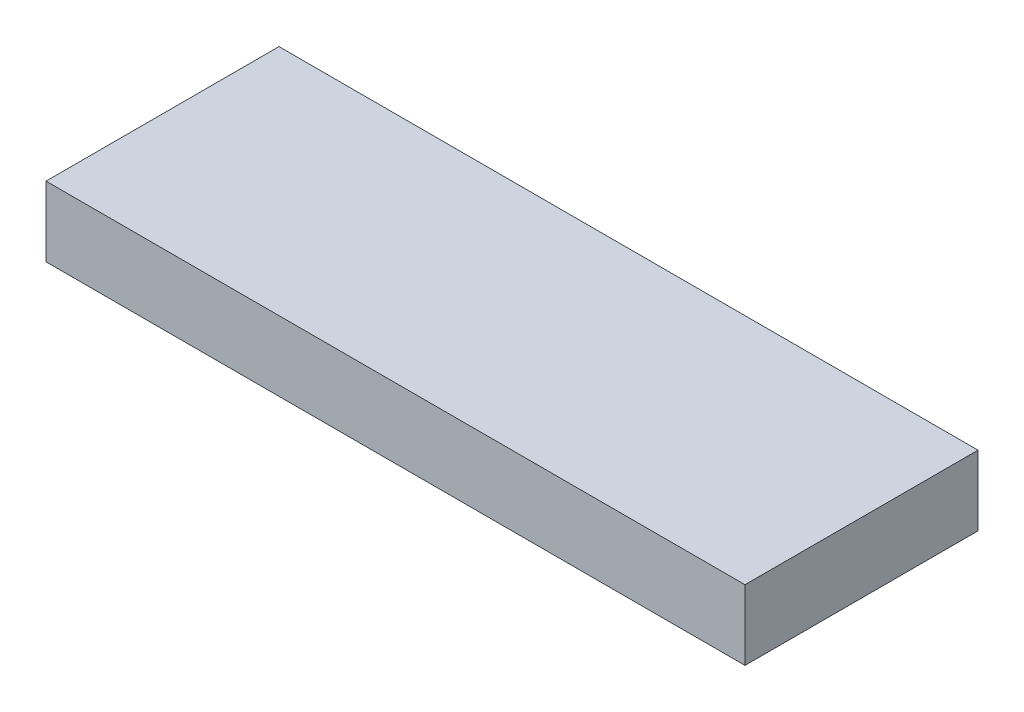
ISO-10303-21;
HEADER;
FILE_DESCRIPTION(('STEP AP214'),'2;1');
FILE_NAME('part.step','',(''),(''),'','','');
FILE_SCHEMA(('AUTOMOTIVE_DESIGN { 1 0 10303 214 1 1 1 1 }'));
ENDSEC;
DATA;
#1=APPLICATION_CONTEXT('core data for automotive mechanical design processes');
#2=APPLICATION_PROTOCOL_DEFINITION('international standard','automotive_design',2000,#1);
#3=PRODUCT_CONTEXT('',#1,'mechanical');
#4=PRODUCT('Part','Part','',(#3));
#5=PRODUCT_RELATED_PRODUCT_CATEGORY('part','',(#4));
#6=PRODUCT_DEFINITION_FORMATION('','',#4);
#7=PRODUCT_DEFINITION_CONTEXT('part definition',#1,'design');
#8=PRODUCT_DEFINITION('design','',#6,#7);
#9=PRODUCT_DEFINITION_SHAPE('','',#8);
#10=(LENGTH_UNIT() NAMED_UNIT(*) SI_UNIT(.MILLI.,.METRE.));
#11=(NAMED_UNIT(*) PLANE_ANGLE_UNIT() SI_UNIT($,.RADIAN.));
#12=(NAMED_UNIT(*) SI_UNIT($,.STERADIAN.) SOLID_ANGLE_UNIT());
#13=UNCERTAINTY_MEASURE_WITH_UNIT(LENGTH_MEASURE(1.E-05),#10,'distance_accuracy_value','');
#14=(GEOMETRIC_REPRESENTATION_CONTEXT(3) GLOBAL_UNCERTAINTY_ASSIGNED_CONTEXT((#13)) GLOBAL_UNIT_ASSIGNED_CONTEXT((#10,
#11,#12)) REPRESENTATION_CONTEXT('',''));
#15=CARTESIAN_POINT('',(0.,0.,0.));
#16=DIRECTION('',(0.,0.,1.));
#17=DIRECTION('',(1.,0.,0.));
#18=AXIS2_PLACEMENT_3D('',#15,#16,#17);
#19=CARTESIAN_POINT('',(75.,7.5,25.));
#20=DIRECTION('',(-1.,0.,0.));
#21=DIRECTION('',(0.,0.,1.));
#22=AXIS2_PLACEMENT_3D('',#19,#20,#21);
#23=PLANE('',#22);
#24=DIRECTION('',(0.,0.,-1.));
#25=VECTOR('',#24,1.);
#26=CARTESIAN_POINT('',(75.,-7.5,25.));
#27=LINE('',#26,#25);
#28=CARTESIAN_POINT('',(75.,-7.5,25.));
#29=VERTEX_POINT('',#28);
#30=CARTESIAN_POINT('',(75.,-7.5,-25.));
#31=VERTEX_POINT('',#30);
#32=EDGE_CURVE('E102',#29,#31,#27,.T.);
#33=ORIENTED_EDGE('',*,*,#32,.T.);
#34=DIRECTION('',(0.,-1.,0.));
#35=VECTOR('',#34,1.);
#36=CARTESIAN_POINT('',(75.,7.5,-25.));
#37=LINE('',#36,#35);
#38=CARTESIAN_POINT('',(75.,7.5,-25.));
#39=VERTEX_POINT('',#38);
#40=EDGE_CURVE('E11',#39,#31,#37,.T.);
#41=ORIENTED_EDGE('',*,*,#40,.F.);
#42=DIRECTION('',(0.,0.,-1.));
#43=VECTOR('',#42,1.);
#44=CARTESIAN_POINT('',(75.,7.5,25.));
#45=LINE('',#44,#43);
#46=CARTESIAN_POINT('',(75.,7.5,25.));
#47=VERTEX_POINT('',#46);
#48=EDGE_CURVE('E90',#47,#39,#45,.T.);
#49=ORIENTED_EDGE('',*,*,#48,.F.);
#50=DIRECTION('',(0.,-1.,0.));
#51=VECTOR('',#50,1.);
#52=CARTESIAN_POINT('',(75.,7.5,25.));
#53=LINE('',#52,#51);
#54=EDGE_CURVE('E98',#47,#29,#53,.T.);
#55=ORIENTED_EDGE('',*,*,#54,.T.);
#56=EDGE_LOOP('',(#33,#41,#49,#55));
#57=FACE_BOUND('',#56,.T.);
#58=ADVANCED_FACE('F39',(#57),#23,.F.);
#59=CARTESIAN_POINT('',(-75.,7.5,-25.));
#60=DIRECTION('',(0.,0.,1.));
#61=DIRECTION('',(1.,0.,0.));
#62=AXIS2_PLACEMENT_3D('',#59,#60,#61);
#63=PLANE('',#62);
#64=DIRECTION('',(-1.,0.,0.));
#65=VECTOR('',#64,1.);
#66=CARTESIAN_POINT('',(-75.,-7.5,-25.));
#67=LINE('',#66,#65);
#68=CARTESIAN_POINT('',(-75.,-7.5,-25.));
#69=VERTEX_POINT('',#68);
#70=EDGE_CURVE('E94',#31,#69,#67,.T.);
#71=ORIENTED_EDGE('',*,*,#70,.T.);
#72=DIRECTION('',(0.,-1.,0.));
#73=VECTOR('',#72,1.);
#74=CARTESIAN_POINT('',(-75.,7.5,-25.));
#75=LINE('',#74,#73);
#76=CARTESIAN_POINT('',(-75.,7.5,-25.));
#77=VERTEX_POINT('',#76);
#78=EDGE_CURVE('E47',#77,#69,#75,.T.);
#79=ORIENTED_EDGE('',*,*,#78,.F.);
#80=DIRECTION('',(-1.,0.,0.));
#81=VECTOR('',#80,1.);
#82=CARTESIAN_POINT('',(-75.,7.5,-25.));
#83=LINE('',#82,#81);
#84=EDGE_CURVE('E85',#39,#77,#83,.T.);
#85=ORIENTED_EDGE('',*,*,#84,.F.);
#86=ORIENTED_EDGE('',*,*,#40,.T.);
#87=EDGE_LOOP('',(#71,#79,#85,#86));
#88=FACE_BOUND('',#87,.T.);
#89=ADVANCED_FACE('F93',(#88),#63,.F.);
#90=CARTESIAN_POINT('',(-75.,7.5,25.));
#91=DIRECTION('',(1.,0.,0.));
#92=DIRECTION('',(0.,0.,-1.));
#93=AXIS2_PLACEMENT_3D('',#90,#91,#92);
#94=PLANE('',#93);
#95=DIRECTION('',(0.,0.,1.));
#96=VECTOR('',#95,1.);
#97=CARTESIAN_POINT('',(-75.,-7.5,25.));
#98=LINE('',#97,#96);
#99=CARTESIAN_POINT('',(-75.,-7.5,25.));
#100=VERTEX_POINT('',#99);
#101=EDGE_CURVE('E72',#69,#100,#98,.T.);
#102=ORIENTED_EDGE('',*,*,#101,.T.);
#103=DIRECTION('',(0.,-1.,0.));
#104=VECTOR('',#103,1.);
#105=CARTESIAN_POINT('',(-75.,7.5,25.));
#106=LINE('',#105,#104);
#107=CARTESIAN_POINT('',(-75.,7.5,25.));
#108=VERTEX_POINT('',#107);
#109=EDGE_CURVE('E95',#108,#100,#106,.T.);
#110=ORIENTED_EDGE('',*,*,#109,.F.);
#111=DIRECTION('',(0.,0.,1.));
#112=VECTOR('',#111,1.);
#113=CARTESIAN_POINT('',(-75.,7.5,25.));
#114=LINE('',#113,#112);
#115=EDGE_CURVE('E88',#77,#108,#114,.T.);
#116=ORIENTED_EDGE('',*,*,#115,.F.);
#117=ORIENTED_EDGE('',*,*,#78,.T.);
#118=EDGE_LOOP('',(#102,#110,#116,#117));
#119=FACE_BOUND('',#118,.T.);
#120=ADVANCED_FACE('F96',(#119),#94,.F.);
#121=CARTESIAN_POINT('',(-75.,7.5,25.));
#122=DIRECTION('',(0.,0.,-1.));
#123=DIRECTION('',(-1.,0.,0.));
#124=AXIS2_PLACEMENT_3D('',#121,#122,#123);
#125=PLANE('',#124);
#126=DIRECTION('',(1.,0.,0.));
#127=VECTOR('',#126,1.);
#128=CARTESIAN_POINT('',(-75.,-7.5,25.));
#129=LINE('',#128,#127);
#130=EDGE_CURVE('E78',#100,#29,#129,.T.);
#131=ORIENTED_EDGE('',*,*,#130,.T.);
#132=ORIENTED_EDGE('',*,*,#54,.F.);
#133=DIRECTION('',(1.,0.,0.));
#134=VECTOR('',#133,1.);
#135=CARTESIAN_POINT('',(-75.,7.5,25.));
#136=LINE('',#135,#134);
#137=EDGE_CURVE('E55',#108,#47,#136,.T.);
#138=ORIENTED_EDGE('',*,*,#137,.F.);
#139=ORIENTED_EDGE('',*,*,#109,.T.);
#140=EDGE_LOOP('',(#131,#132,#138,#139));
#141=FACE_BOUND('',#140,.T.);
#142=ADVANCED_FACE('F109',(#141),#125,.F.);
#143=CARTESIAN_POINT('',(0.,7.5,0.));
#144=DIRECTION('',(0.,-1.,0.));
#145=DIRECTION('',(0.,0.,-1.));
#146=AXIS2_PLACEMENT_3D('',#143,#144,#145);
#147=PLANE('',#146);
#148=ORIENTED_EDGE('',*,*,#48,.T.);
#149=ORIENTED_EDGE('',*,*,#84,.T.);
#150=ORIENTED_EDGE('',*,*,#115,.T.);
#151=ORIENTED_EDGE('',*,*,#137,.T.);
#152=EDGE_LOOP('',(#148,#149,#150,#151));
#153=FACE_BOUND('',#152,.T.);
#154=ADVANCED_FACE('F86',(#153),#147,.F.);
#155=CARTESIAN_POINT('',(0.,-7.5,0.));
#156=DIRECTION('',(0.,-1.,0.));
#157=DIRECTION('',(0.,0.,-1.));
#158=AXIS2_PLACEMENT_3D('',#155,#156,#157);
#159=PLANE('',#158);
#160=ORIENTED_EDGE('',*,*,#32,.F.);
#161=ORIENTED_EDGE('',*,*,#130,.F.);
#162=ORIENTED_EDGE('',*,*,#101,.F.);
#163=ORIENTED_EDGE('',*,*,#70,.F.);
#164=EDGE_LOOP('',(#160,#161,#162,#163));
#165=FACE_BOUND('',#164,.T.);
#166=ADVANCED_FACE('F112',(#165),#159,.T.);
#167=CLOSED_SHELL('',(#58,#89,#120,#142,#154,#166));
#168=MANIFOLD_SOLID_BREP('B2',#167);
#169=ADVANCED_BREP_SHAPE_REPRESENTATION('',(#18,#168),#14);
#170=SHAPE_DEFINITION_REPRESENTATION(#9,#169);
ENDSEC;
END-ISO-10303-21;
